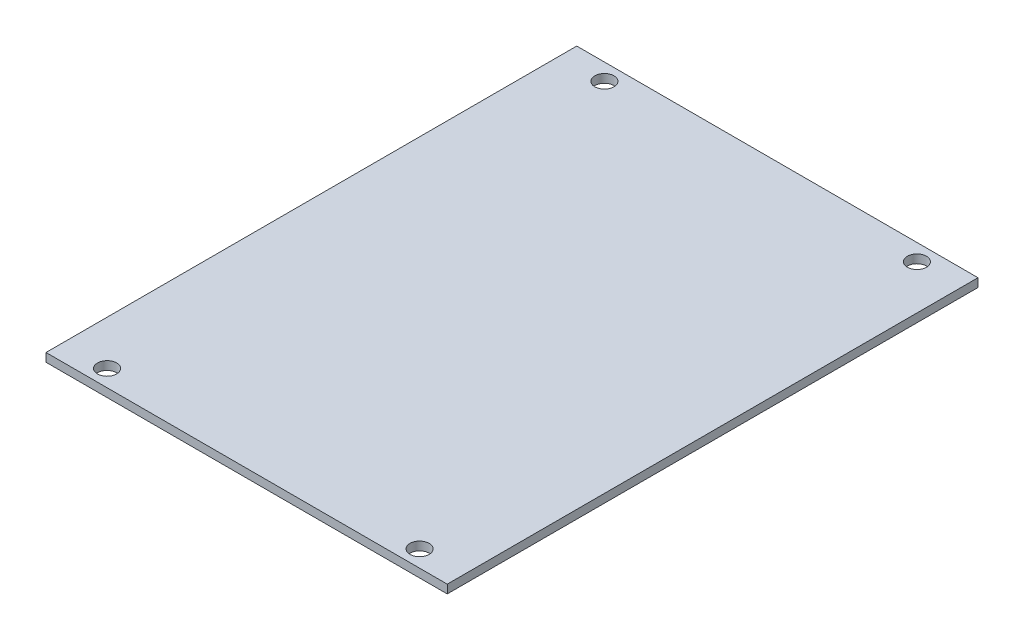
ISO-10303-21;
HEADER;
FILE_DESCRIPTION(('STEP AP214'),'2;1');
FILE_NAME('part.step','',(''),(''),'','','');
FILE_SCHEMA(('AUTOMOTIVE_DESIGN { 1 0 10303 214 1 1 1 1 }'));
ENDSEC;
DATA;
#1=APPLICATION_CONTEXT('core data for automotive mechanical design processes');
#2=APPLICATION_PROTOCOL_DEFINITION('international standard','automotive_design',2000,#1);
#3=PRODUCT_CONTEXT('',#1,'mechanical');
#4=PRODUCT('Part','Part','',(#3));
#5=PRODUCT_RELATED_PRODUCT_CATEGORY('part','',(#4));
#6=PRODUCT_DEFINITION_FORMATION('','',#4);
#7=PRODUCT_DEFINITION_CONTEXT('part definition',#1,'design');
#8=PRODUCT_DEFINITION('design','',#6,#7);
#9=PRODUCT_DEFINITION_SHAPE('','',#8);
#10=(LENGTH_UNIT() NAMED_UNIT(*) SI_UNIT(.MILLI.,.METRE.));
#11=(NAMED_UNIT(*) PLANE_ANGLE_UNIT() SI_UNIT($,.RADIAN.));
#12=(NAMED_UNIT(*) SI_UNIT($,.STERADIAN.) SOLID_ANGLE_UNIT());
#13=UNCERTAINTY_MEASURE_WITH_UNIT(LENGTH_MEASURE(1.E-05),#10,'distance_accuracy_value','');
#14=(GEOMETRIC_REPRESENTATION_CONTEXT(3) GLOBAL_UNCERTAINTY_ASSIGNED_CONTEXT((#13)) GLOBAL_UNIT_ASSIGNED_CONTEXT((#10,
#11,#12)) REPRESENTATION_CONTEXT('',''));
#15=CARTESIAN_POINT('',(0.,0.,0.));
#16=DIRECTION('',(0.,0.,1.));
#17=DIRECTION('',(1.,0.,0.));
#18=AXIS2_PLACEMENT_3D('',#15,#16,#17);
#19=CARTESIAN_POINT('',(35.9283,1.524,47.5234));
#20=DIRECTION('',(-1.,0.,0.));
#21=DIRECTION('',(0.,0.,1.));
#22=AXIS2_PLACEMENT_3D('',#19,#20,#21);
#23=PLANE('',#22);
#24=DIRECTION('',(0.,0.,-1.));
#25=VECTOR('',#24,1.);
#26=CARTESIAN_POINT('',(35.9283,0.,47.5234));
#27=LINE('',#26,#25);
#28=CARTESIAN_POINT('',(35.9283,0.,47.5234));
#29=VERTEX_POINT('',#28);
#30=CARTESIAN_POINT('',(35.9283,0.,-47.5234));
#31=VERTEX_POINT('',#30);
#32=EDGE_CURVE('E96',#29,#31,#27,.T.);
#33=ORIENTED_EDGE('',*,*,#32,.T.);
#34=DIRECTION('',(0.,-1.,0.));
#35=VECTOR('',#34,1.);
#36=CARTESIAN_POINT('',(35.9283,1.524,-47.5234));
#37=LINE('',#36,#35);
#38=CARTESIAN_POINT('',(35.9283,1.524,-47.5234));
#39=VERTEX_POINT('',#38);
#40=EDGE_CURVE('E11',#39,#31,#37,.T.);
#41=ORIENTED_EDGE('',*,*,#40,.F.);
#42=DIRECTION('',(0.,0.,-1.));
#43=VECTOR('',#42,1.);
#44=CARTESIAN_POINT('',(35.9283,1.524,47.5234));
#45=LINE('',#44,#43);
#46=CARTESIAN_POINT('',(35.9283,1.524,47.5234));
#47=VERTEX_POINT('',#46);
#48=EDGE_CURVE('E84',#47,#39,#45,.T.);
#49=ORIENTED_EDGE('',*,*,#48,.F.);
#50=DIRECTION('',(0.,-1.,0.));
#51=VECTOR('',#50,1.);
#52=CARTESIAN_POINT('',(35.9283,1.524,47.5234));
#53=LINE('',#52,#51);
#54=EDGE_CURVE('E92',#47,#29,#53,.T.);
#55=ORIENTED_EDGE('',*,*,#54,.T.);
#56=EDGE_LOOP('',(#33,#41,#49,#55));
#57=FACE_BOUND('',#56,.T.);
#58=ADVANCED_FACE('F33',(#57),#23,.F.);
#59=CARTESIAN_POINT('',(-35.9283,1.524,-47.5234));
#60=DIRECTION('',(0.,0.,1.));
#61=DIRECTION('',(1.,0.,0.));
#62=AXIS2_PLACEMENT_3D('',#59,#60,#61);
#63=PLANE('',#62);
#64=DIRECTION('',(-1.,0.,0.));
#65=VECTOR('',#64,1.);
#66=CARTESIAN_POINT('',(-35.9283,0.,-47.5234));
#67=LINE('',#66,#65);
#68=CARTESIAN_POINT('',(-35.9283,0.,-47.5234));
#69=VERTEX_POINT('',#68);
#70=EDGE_CURVE('E88',#31,#69,#67,.T.);
#71=ORIENTED_EDGE('',*,*,#70,.T.);
#72=DIRECTION('',(0.,-1.,0.));
#73=VECTOR('',#72,1.);
#74=CARTESIAN_POINT('',(-35.9283,1.524,-47.5234));
#75=LINE('',#74,#73);
#76=CARTESIAN_POINT('',(-35.9283,1.524,-47.5234));
#77=VERTEX_POINT('',#76);
#78=EDGE_CURVE('E41',#77,#69,#75,.T.);
#79=ORIENTED_EDGE('',*,*,#78,.F.);
#80=DIRECTION('',(-1.,0.,0.));
#81=VECTOR('',#80,1.);
#82=CARTESIAN_POINT('',(-35.9283,1.524,-47.5234));
#83=LINE('',#82,#81);
#84=EDGE_CURVE('E79',#39,#77,#83,.T.);
#85=ORIENTED_EDGE('',*,*,#84,.F.);
#86=ORIENTED_EDGE('',*,*,#40,.T.);
#87=EDGE_LOOP('',(#71,#79,#85,#86));
#88=FACE_BOUND('',#87,.T.);
#89=ADVANCED_FACE('F87',(#88),#63,.F.);
#90=CARTESIAN_POINT('',(-35.9283,1.524,47.5234));
#91=DIRECTION('',(1.,0.,0.));
#92=DIRECTION('',(0.,0.,-1.));
#93=AXIS2_PLACEMENT_3D('',#90,#91,#92);
#94=PLANE('',#93);
#95=DIRECTION('',(0.,0.,1.));
#96=VECTOR('',#95,1.);
#97=CARTESIAN_POINT('',(-35.9283,0.,47.5234));
#98=LINE('',#97,#96);
#99=CARTESIAN_POINT('',(-35.9283,0.,47.5234));
#100=VERTEX_POINT('',#99);
#101=EDGE_CURVE('E66',#69,#100,#98,.T.);
#102=ORIENTED_EDGE('',*,*,#101,.T.);
#103=DIRECTION('',(0.,-1.,0.));
#104=VECTOR('',#103,1.);
#105=CARTESIAN_POINT('',(-35.9283,1.524,47.5234));
#106=LINE('',#105,#104);
#107=CARTESIAN_POINT('',(-35.9283,1.524,47.5234));
#108=VERTEX_POINT('',#107);
#109=EDGE_CURVE('E89',#108,#100,#106,.T.);
#110=ORIENTED_EDGE('',*,*,#109,.F.);
#111=DIRECTION('',(0.,0.,1.));
#112=VECTOR('',#111,1.);
#113=CARTESIAN_POINT('',(-35.9283,1.524,47.5234));
#114=LINE('',#113,#112);
#115=EDGE_CURVE('E82',#77,#108,#114,.T.);
#116=ORIENTED_EDGE('',*,*,#115,.F.);
#117=ORIENTED_EDGE('',*,*,#78,.T.);
#118=EDGE_LOOP('',(#102,#110,#116,#117));
#119=FACE_BOUND('',#118,.T.);
#120=ADVANCED_FACE('F90',(#119),#94,.F.);
#121=CARTESIAN_POINT('',(-35.9283,1.524,47.5234));
#122=DIRECTION('',(0.,0.,-1.));
#123=DIRECTION('',(-1.,0.,0.));
#124=AXIS2_PLACEMENT_3D('',#121,#122,#123);
#125=PLANE('',#124);
#126=DIRECTION('',(1.,0.,0.));
#127=VECTOR('',#126,1.);
#128=CARTESIAN_POINT('',(-35.9283,0.,47.5234));
#129=LINE('',#128,#127);
#130=EDGE_CURVE('E72',#100,#29,#129,.T.);
#131=ORIENTED_EDGE('',*,*,#130,.T.);
#132=ORIENTED_EDGE('',*,*,#54,.F.);
#133=DIRECTION('',(1.,0.,0.));
#134=VECTOR('',#133,1.);
#135=CARTESIAN_POINT('',(-35.9283,1.524,47.5234));
#136=LINE('',#135,#134);
#137=EDGE_CURVE('E49',#108,#47,#136,.T.);
#138=ORIENTED_EDGE('',*,*,#137,.F.);
#139=ORIENTED_EDGE('',*,*,#109,.T.);
#140=EDGE_LOOP('',(#131,#132,#138,#139));
#141=FACE_BOUND('',#140,.T.);
#142=ADVANCED_FACE('F104',(#141),#125,.F.);
#143=CARTESIAN_POINT('',(0.,1.524,0.));
#144=DIRECTION('',(0.,-1.,0.));
#145=DIRECTION('',(0.,0.,-1.));
#146=AXIS2_PLACEMENT_3D('',#143,#144,#145);
#147=PLANE('',#146);
#148=CARTESIAN_POINT('',(-27.981275,1.524,44.53255));
#149=DIRECTION('',(0.,1.,0.));
#150=DIRECTION('',(0.,0.,1.));
#151=AXIS2_PLACEMENT_3D('',#148,#149,#150);
#152=CIRCLE('',#151,1.7145);
#153=CARTESIAN_POINT('',(-27.981275,1.524,46.24705));
#154=VERTEX_POINT('',#153);
#155=EDGE_CURVE('E128',#154,#154,#152,.T.);
#156=ORIENTED_EDGE('',*,*,#155,.F.);
#157=EDGE_LOOP('',(#156));
#158=FACE_BOUND('',#157,.T.);
#159=CARTESIAN_POINT('',(27.981275,1.524,44.53255));
#160=DIRECTION('',(0.,1.,0.));
#161=DIRECTION('',(0.,0.,1.));
#162=AXIS2_PLACEMENT_3D('',#159,#160,#161);
#163=CIRCLE('',#162,1.7145);
#164=CARTESIAN_POINT('',(27.981275,1.524,46.24705));
#165=VERTEX_POINT('',#164);
#166=EDGE_CURVE('E122',#165,#165,#163,.T.);
#167=ORIENTED_EDGE('',*,*,#166,.F.);
#168=EDGE_LOOP('',(#167));
#169=FACE_BOUND('',#168,.T.);
#170=CARTESIAN_POINT('',(27.981275,1.524,-44.53255));
#171=DIRECTION('',(0.,1.,0.));
#172=DIRECTION('',(0.,0.,1.));
#173=AXIS2_PLACEMENT_3D('',#170,#171,#172);
#174=CIRCLE('',#173,1.7145);
#175=CARTESIAN_POINT('',(27.981275,1.524,-42.81805));
#176=VERTEX_POINT('',#175);
#177=EDGE_CURVE('E116',#176,#176,#174,.T.);
#178=ORIENTED_EDGE('',*,*,#177,.F.);
#179=EDGE_LOOP('',(#178));
#180=FACE_BOUND('',#179,.T.);
#181=CARTESIAN_POINT('',(-27.981275,1.524,-44.53255));
#182=DIRECTION('',(0.,1.,0.));
#183=DIRECTION('',(0.,0.,1.));
#184=AXIS2_PLACEMENT_3D('',#181,#182,#183);
#185=CIRCLE('',#184,1.7145);
#186=CARTESIAN_POINT('',(-27.981275,1.524,-42.81805));
#187=VERTEX_POINT('',#186);
#188=EDGE_CURVE('E110',#187,#187,#185,.T.);
#189=ORIENTED_EDGE('',*,*,#188,.F.);
#190=EDGE_LOOP('',(#189));
#191=FACE_BOUND('',#190,.T.);
#192=ORIENTED_EDGE('',*,*,#48,.T.);
#193=ORIENTED_EDGE('',*,*,#84,.T.);
#194=ORIENTED_EDGE('',*,*,#115,.T.);
#195=ORIENTED_EDGE('',*,*,#137,.T.);
#196=EDGE_LOOP('',(#192,#193,#194,#195));
#197=FACE_BOUND('',#196,.T.);
#198=ADVANCED_FACE('F80',(#158,#169,#180,#191,#197),#147,.F.);
#199=CARTESIAN_POINT('',(0.,0.,0.));
#200=DIRECTION('',(0.,-1.,0.));
#201=DIRECTION('',(0.,0.,-1.));
#202=AXIS2_PLACEMENT_3D('',#199,#200,#201);
#203=PLANE('',#202);
#204=CARTESIAN_POINT('',(-27.981275,0.,44.53255));
#205=DIRECTION('',(0.,1.,0.));
#206=DIRECTION('',(0.,0.,1.));
#207=AXIS2_PLACEMENT_3D('',#204,#205,#206);
#208=CIRCLE('',#207,1.7145);
#209=CARTESIAN_POINT('',(-27.981275,0.,46.24705));
#210=VERTEX_POINT('',#209);
#211=EDGE_CURVE('E125',#210,#210,#208,.T.);
#212=ORIENTED_EDGE('',*,*,#211,.T.);
#213=EDGE_LOOP('',(#212));
#214=FACE_BOUND('',#213,.T.);
#215=CARTESIAN_POINT('',(27.981275,0.,44.53255));
#216=DIRECTION('',(0.,1.,0.));
#217=DIRECTION('',(0.,0.,1.));
#218=AXIS2_PLACEMENT_3D('',#215,#216,#217);
#219=CIRCLE('',#218,1.7145);
#220=CARTESIAN_POINT('',(27.981275,0.,46.24705));
#221=VERTEX_POINT('',#220);
#222=EDGE_CURVE('E119',#221,#221,#219,.T.);
#223=ORIENTED_EDGE('',*,*,#222,.T.);
#224=EDGE_LOOP('',(#223));
#225=FACE_BOUND('',#224,.T.);
#226=CARTESIAN_POINT('',(27.981275,0.,-44.53255));
#227=DIRECTION('',(0.,1.,0.));
#228=DIRECTION('',(0.,0.,1.));
#229=AXIS2_PLACEMENT_3D('',#226,#227,#228);
#230=CIRCLE('',#229,1.7145);
#231=CARTESIAN_POINT('',(27.981275,0.,-42.81805));
#232=VERTEX_POINT('',#231);
#233=EDGE_CURVE('E113',#232,#232,#230,.T.);
#234=ORIENTED_EDGE('',*,*,#233,.T.);
#235=EDGE_LOOP('',(#234));
#236=FACE_BOUND('',#235,.T.);
#237=CARTESIAN_POINT('',(-27.981275,0.,-44.53255));
#238=DIRECTION('',(0.,1.,0.));
#239=DIRECTION('',(0.,0.,1.));
#240=AXIS2_PLACEMENT_3D('',#237,#238,#239);
#241=CIRCLE('',#240,1.7145);
#242=CARTESIAN_POINT('',(-27.981275,0.,-42.81805));
#243=VERTEX_POINT('',#242);
#244=EDGE_CURVE('E99',#243,#243,#241,.T.);
#245=ORIENTED_EDGE('',*,*,#244,.T.);
#246=EDGE_LOOP('',(#245));
#247=FACE_BOUND('',#246,.T.);
#248=ORIENTED_EDGE('',*,*,#32,.F.);
#249=ORIENTED_EDGE('',*,*,#130,.F.);
#250=ORIENTED_EDGE('',*,*,#101,.F.);
#251=ORIENTED_EDGE('',*,*,#70,.F.);
#252=EDGE_LOOP('',(#248,#249,#250,#251));
#253=FACE_BOUND('',#252,.T.);
#254=ADVANCED_FACE('F107',(#214,#225,#236,#247,#253),#203,.T.);
#255=CARTESIAN_POINT('',(-27.981275,0.,-44.53255));
#256=DIRECTION('',(0.,1.,0.));
#257=DIRECTION('',(0.,0.,1.));
#258=AXIS2_PLACEMENT_3D('',#255,#256,#257);
#259=CYLINDRICAL_SURFACE('',#258,1.7145);
#260=CARTESIAN_POINT('',(-27.981275,0.,-42.81805));
#261=CARTESIAN_POINT('',(-27.981275,0.015875,-42.81805));
#262=CARTESIAN_POINT('',(-27.981275,0.03175,-42.81805));
#263=CARTESIAN_POINT('',(-27.981275,0.0635,-42.81805));
#264=CARTESIAN_POINT('',(-27.981275,0.079375,-42.81805));
#265=CARTESIAN_POINT('',(-27.981275,0.111125,-42.81805));
#266=CARTESIAN_POINT('',(-27.981275,0.127,-42.81805));
#267=CARTESIAN_POINT('',(-27.981275,0.15875,-42.81805));
#268=CARTESIAN_POINT('',(-27.981275,0.174625,-42.81805));
#269=CARTESIAN_POINT('',(-27.981275,0.206375,-42.81805));
#270=CARTESIAN_POINT('',(-27.981275,0.22225,-42.81805));
#271=CARTESIAN_POINT('',(-27.981275,0.254,-42.81805));
#272=CARTESIAN_POINT('',(-27.981275,0.269875,-42.81805));
#273=CARTESIAN_POINT('',(-27.981275,0.301625,-42.81805));
#274=CARTESIAN_POINT('',(-27.981275,0.3175,-42.81805));
#275=CARTESIAN_POINT('',(-27.981275,0.34925,-42.81805));
#276=CARTESIAN_POINT('',(-27.981275,0.365125,-42.81805));
#277=CARTESIAN_POINT('',(-27.981275,0.396875,-42.81805));
#278=CARTESIAN_POINT('',(-27.981275,0.41275,-42.81805));
#279=CARTESIAN_POINT('',(-27.981275,0.4445,-42.81805));
#280=CARTESIAN_POINT('',(-27.981275,0.460375,-42.81805));
#281=CARTESIAN_POINT('',(-27.981275,0.492125,-42.81805));
#282=CARTESIAN_POINT('',(-27.981275,0.508,-42.81805));
#283=CARTESIAN_POINT('',(-27.981275,0.53975,-42.81805));
#284=CARTESIAN_POINT('',(-27.981275,0.555625,-42.81805));
#285=CARTESIAN_POINT('',(-27.981275,0.587375,-42.81805));
#286=CARTESIAN_POINT('',(-27.981275,0.60325,-42.81805));
#287=CARTESIAN_POINT('',(-27.981275,0.635,-42.81805));
#288=CARTESIAN_POINT('',(-27.981275,0.650875,-42.81805));
#289=CARTESIAN_POINT('',(-27.981275,0.682625,-42.81805));
#290=CARTESIAN_POINT('',(-27.981275,0.6985,-42.81805));
#291=CARTESIAN_POINT('',(-27.981275,0.73025,-42.81805));
#292=CARTESIAN_POINT('',(-27.981275,0.746125,-42.81805));
#293=CARTESIAN_POINT('',(-27.981275,0.777875,-42.81805));
#294=CARTESIAN_POINT('',(-27.981275,0.79375,-42.81805));
#295=CARTESIAN_POINT('',(-27.981275,0.8255,-42.81805));
#296=CARTESIAN_POINT('',(-27.981275,0.841375,-42.81805));
#297=CARTESIAN_POINT('',(-27.981275,0.873125,-42.81805));
#298=CARTESIAN_POINT('',(-27.981275,0.889,-42.81805));
#299=CARTESIAN_POINT('',(-27.981275,0.92075,-42.81805));
#300=CARTESIAN_POINT('',(-27.981275,0.936625,-42.81805));
#301=CARTESIAN_POINT('',(-27.981275,0.968375,-42.81805));
#302=CARTESIAN_POINT('',(-27.981275,0.98425,-42.81805));
#303=CARTESIAN_POINT('',(-27.981275,1.016,-42.81805));
#304=CARTESIAN_POINT('',(-27.981275,1.031875,-42.81805));
#305=CARTESIAN_POINT('',(-27.981275,1.063625,-42.81805));
#306=CARTESIAN_POINT('',(-27.981275,1.0795,-42.81805));
#307=CARTESIAN_POINT('',(-27.981275,1.11125,-42.81805));
#308=CARTESIAN_POINT('',(-27.981275,1.127125,-42.81805));
#309=CARTESIAN_POINT('',(-27.981275,1.158875,-42.81805));
#310=CARTESIAN_POINT('',(-27.981275,1.17475,-42.81805));
#311=CARTESIAN_POINT('',(-27.981275,1.2065,-42.81805));
#312=CARTESIAN_POINT('',(-27.981275,1.222375,-42.81805));
#313=CARTESIAN_POINT('',(-27.981275,1.254125,-42.81805));
#314=CARTESIAN_POINT('',(-27.981275,1.27,-42.81805));
#315=CARTESIAN_POINT('',(-27.981275,1.30175,-42.81805));
#316=CARTESIAN_POINT('',(-27.981275,1.317625,-42.81805));
#317=CARTESIAN_POINT('',(-27.981275,1.349375,-42.81805));
#318=CARTESIAN_POINT('',(-27.981275,1.36525,-42.81805));
#319=CARTESIAN_POINT('',(-27.981275,1.397,-42.81805));
#320=CARTESIAN_POINT('',(-27.981275,1.412875,-42.81805));
#321=CARTESIAN_POINT('',(-27.981275,1.444625,-42.81805));
#322=CARTESIAN_POINT('',(-27.981275,1.4605,-42.81805));
#323=CARTESIAN_POINT('',(-27.981275,1.49225,-42.81805));
#324=CARTESIAN_POINT('',(-27.981275,1.508125,-42.81805));
#325=CARTESIAN_POINT('',(-27.981275,1.524,-42.81805));
#326=B_SPLINE_CURVE_WITH_KNOTS('',3,(#260,#261,#262,#263,#264,#265,#266,#267,#268,#269,#270,
#271,#272,#273,#274,#275,#276,#277,#278,#279,#280,#281,#282,#283,#284,#285,#286,#287,#288,#289,
#290,#291,#292,#293,#294,#295,#296,#297,#298,#299,#300,#301,#302,#303,#304,#305,#306,#307,#308,
#309,#310,#311,#312,#313,#314,#315,#316,#317,#318,#319,#320,#321,#322,#323,#324,#325),
.UNSPECIFIED.,.F.,.F.,(4,2,2,2,2,2,2,2,2,2,2,2,2,2,2,2,2,2,2,2,2,2,2,2,2,2,2,2,2,2,2,2,4),(0.,
0.047625,0.09525,0.142875,0.1905,0.238125,0.28575,0.333375,0.381,0.428625,0.47625,0.523875,
0.5715,0.619125,0.66675,0.714375,0.762,0.809625,0.85725,0.904875,0.9525,1.000125,1.04775,
1.095375,1.143,1.190625,1.23825,1.285875,1.3335,1.381125,1.42875,1.476375,1.524),.UNSPECIFIED.);
#327=EDGE_CURVE('BSEAM152',#243,#187,#326,.T.);
#328=ORIENTED_EDGE('',*,*,#244,.F.);
#329=ORIENTED_EDGE('',*,*,#188,.T.);
#330=ORIENTED_EDGE('',*,*,#327,.T.);
#331=ORIENTED_EDGE('',*,*,#327,.F.);
#332=EDGE_LOOP('',(#328,#330,#329,#331));
#333=FACE_BOUND('',#332,.T.);
#334=ADVANCED_FACE('F152',(#333),#259,.F.);
#335=CARTESIAN_POINT('',(27.981275,0.,-44.53255));
#336=DIRECTION('',(0.,1.,0.));
#337=DIRECTION('',(0.,0.,1.));
#338=AXIS2_PLACEMENT_3D('',#335,#336,#337);
#339=CYLINDRICAL_SURFACE('',#338,1.7145);
#340=CARTESIAN_POINT('',(27.981275,0.,-42.81805));
#341=CARTESIAN_POINT('',(27.981275,0.015875,-42.81805));
#342=CARTESIAN_POINT('',(27.981275,0.03175,-42.81805));
#343=CARTESIAN_POINT('',(27.981275,0.0635,-42.81805));
#344=CARTESIAN_POINT('',(27.981275,0.079375,-42.81805));
#345=CARTESIAN_POINT('',(27.981275,0.111125,-42.81805));
#346=CARTESIAN_POINT('',(27.981275,0.127,-42.81805));
#347=CARTESIAN_POINT('',(27.981275,0.15875,-42.81805));
#348=CARTESIAN_POINT('',(27.981275,0.174625,-42.81805));
#349=CARTESIAN_POINT('',(27.981275,0.206375,-42.81805));
#350=CARTESIAN_POINT('',(27.981275,0.22225,-42.81805));
#351=CARTESIAN_POINT('',(27.981275,0.254,-42.81805));
#352=CARTESIAN_POINT('',(27.981275,0.269875,-42.81805));
#353=CARTESIAN_POINT('',(27.981275,0.301625,-42.81805));
#354=CARTESIAN_POINT('',(27.981275,0.3175,-42.81805));
#355=CARTESIAN_POINT('',(27.981275,0.34925,-42.81805));
#356=CARTESIAN_POINT('',(27.981275,0.365125,-42.81805));
#357=CARTESIAN_POINT('',(27.981275,0.396875,-42.81805));
#358=CARTESIAN_POINT('',(27.981275,0.41275,-42.81805));
#359=CARTESIAN_POINT('',(27.981275,0.4445,-42.81805));
#360=CARTESIAN_POINT('',(27.981275,0.460375,-42.81805));
#361=CARTESIAN_POINT('',(27.981275,0.492125,-42.81805));
#362=CARTESIAN_POINT('',(27.981275,0.508,-42.81805));
#363=CARTESIAN_POINT('',(27.981275,0.53975,-42.81805));
#364=CARTESIAN_POINT('',(27.981275,0.555625,-42.81805));
#365=CARTESIAN_POINT('',(27.981275,0.587375,-42.81805));
#366=CARTESIAN_POINT('',(27.981275,0.60325,-42.81805));
#367=CARTESIAN_POINT('',(27.981275,0.635,-42.81805));
#368=CARTESIAN_POINT('',(27.981275,0.650875,-42.81805));
#369=CARTESIAN_POINT('',(27.981275,0.682625,-42.81805));
#370=CARTESIAN_POINT('',(27.981275,0.6985,-42.81805));
#371=CARTESIAN_POINT('',(27.981275,0.73025,-42.81805));
#372=CARTESIAN_POINT('',(27.981275,0.746125,-42.81805));
#373=CARTESIAN_POINT('',(27.981275,0.777875,-42.81805));
#374=CARTESIAN_POINT('',(27.981275,0.79375,-42.81805));
#375=CARTESIAN_POINT('',(27.981275,0.8255,-42.81805));
#376=CARTESIAN_POINT('',(27.981275,0.841375,-42.81805));
#377=CARTESIAN_POINT('',(27.981275,0.873125,-42.81805));
#378=CARTESIAN_POINT('',(27.981275,0.889,-42.81805));
#379=CARTESIAN_POINT('',(27.981275,0.92075,-42.81805));
#380=CARTESIAN_POINT('',(27.981275,0.936625,-42.81805));
#381=CARTESIAN_POINT('',(27.981275,0.968375,-42.81805));
#382=CARTESIAN_POINT('',(27.981275,0.98425,-42.81805));
#383=CARTESIAN_POINT('',(27.981275,1.016,-42.81805));
#384=CARTESIAN_POINT('',(27.981275,1.031875,-42.81805));
#385=CARTESIAN_POINT('',(27.981275,1.063625,-42.81805));
#386=CARTESIAN_POINT('',(27.981275,1.0795,-42.81805));
#387=CARTESIAN_POINT('',(27.981275,1.11125,-42.81805));
#388=CARTESIAN_POINT('',(27.981275,1.127125,-42.81805));
#389=CARTESIAN_POINT('',(27.981275,1.158875,-42.81805));
#390=CARTESIAN_POINT('',(27.981275,1.17475,-42.81805));
#391=CARTESIAN_POINT('',(27.981275,1.2065,-42.81805));
#392=CARTESIAN_POINT('',(27.981275,1.222375,-42.81805));
#393=CARTESIAN_POINT('',(27.981275,1.254125,-42.81805));
#394=CARTESIAN_POINT('',(27.981275,1.27,-42.81805));
#395=CARTESIAN_POINT('',(27.981275,1.30175,-42.81805));
#396=CARTESIAN_POINT('',(27.981275,1.317625,-42.81805));
#397=CARTESIAN_POINT('',(27.981275,1.349375,-42.81805));
#398=CARTESIAN_POINT('',(27.981275,1.36525,-42.81805));
#399=CARTESIAN_POINT('',(27.981275,1.397,-42.81805));
#400=CARTESIAN_POINT('',(27.981275,1.412875,-42.81805));
#401=CARTESIAN_POINT('',(27.981275,1.444625,-42.81805));
#402=CARTESIAN_POINT('',(27.981275,1.4605,-42.81805));
#403=CARTESIAN_POINT('',(27.981275,1.49225,-42.81805));
#404=CARTESIAN_POINT('',(27.981275,1.508125,-42.81805));
#405=CARTESIAN_POINT('',(27.981275,1.524,-42.81805));
#406=B_SPLINE_CURVE_WITH_KNOTS('',3,(#340,#341,#342,#343,#344,#345,#346,#347,#348,#349,#350,
#351,#352,#353,#354,#355,#356,#357,#358,#359,#360,#361,#362,#363,#364,#365,#366,#367,#368,#369,
#370,#371,#372,#373,#374,#375,#376,#377,#378,#379,#380,#381,#382,#383,#384,#385,#386,#387,#388,
#389,#390,#391,#392,#393,#394,#395,#396,#397,#398,#399,#400,#401,#402,#403,#404,#405),
.UNSPECIFIED.,.F.,.F.,(4,2,2,2,2,2,2,2,2,2,2,2,2,2,2,2,2,2,2,2,2,2,2,2,2,2,2,2,2,2,2,2,4),(0.,
0.047625,0.09525,0.142875,0.1905,0.238125,0.28575,0.333375,0.381,0.428625,0.47625,0.523875,
0.5715,0.619125,0.66675,0.714375,0.762,0.809625,0.85725,0.904875,0.9525,1.000125,1.04775,
1.095375,1.143,1.190625,1.23825,1.285875,1.3335,1.381125,1.42875,1.476375,1.524),.UNSPECIFIED.);
#407=EDGE_CURVE('BSEAM154',#232,#176,#406,.T.);
#408=ORIENTED_EDGE('',*,*,#233,.F.);
#409=ORIENTED_EDGE('',*,*,#177,.T.);
#410=ORIENTED_EDGE('',*,*,#407,.T.);
#411=ORIENTED_EDGE('',*,*,#407,.F.);
#412=EDGE_LOOP('',(#408,#410,#409,#411));
#413=FACE_BOUND('',#412,.T.);
#414=ADVANCED_FACE('F154',(#413),#339,.F.);
#415=CARTESIAN_POINT('',(27.981275,0.,44.53255));
#416=DIRECTION('',(0.,1.,0.));
#417=DIRECTION('',(0.,0.,1.));
#418=AXIS2_PLACEMENT_3D('',#415,#416,#417);
#419=CYLINDRICAL_SURFACE('',#418,1.7145);
#420=CARTESIAN_POINT('',(27.981275,0.,46.24705));
#421=CARTESIAN_POINT('',(27.981275,0.015875,46.24705));
#422=CARTESIAN_POINT('',(27.981275,0.03175,46.24705));
#423=CARTESIAN_POINT('',(27.981275,0.0635,46.24705));
#424=CARTESIAN_POINT('',(27.981275,0.079375,46.24705));
#425=CARTESIAN_POINT('',(27.981275,0.111125,46.24705));
#426=CARTESIAN_POINT('',(27.981275,0.127,46.24705));
#427=CARTESIAN_POINT('',(27.981275,0.15875,46.24705));
#428=CARTESIAN_POINT('',(27.981275,0.174625,46.24705));
#429=CARTESIAN_POINT('',(27.981275,0.206375,46.24705));
#430=CARTESIAN_POINT('',(27.981275,0.22225,46.24705));
#431=CARTESIAN_POINT('',(27.981275,0.254,46.24705));
#432=CARTESIAN_POINT('',(27.981275,0.269875,46.24705));
#433=CARTESIAN_POINT('',(27.981275,0.301625,46.24705));
#434=CARTESIAN_POINT('',(27.981275,0.3175,46.24705));
#435=CARTESIAN_POINT('',(27.981275,0.34925,46.24705));
#436=CARTESIAN_POINT('',(27.981275,0.365125,46.24705));
#437=CARTESIAN_POINT('',(27.981275,0.396875,46.24705));
#438=CARTESIAN_POINT('',(27.981275,0.41275,46.24705));
#439=CARTESIAN_POINT('',(27.981275,0.4445,46.24705));
#440=CARTESIAN_POINT('',(27.981275,0.460375,46.24705));
#441=CARTESIAN_POINT('',(27.981275,0.492125,46.24705));
#442=CARTESIAN_POINT('',(27.981275,0.508,46.24705));
#443=CARTESIAN_POINT('',(27.981275,0.53975,46.24705));
#444=CARTESIAN_POINT('',(27.981275,0.555625,46.24705));
#445=CARTESIAN_POINT('',(27.981275,0.587375,46.24705));
#446=CARTESIAN_POINT('',(27.981275,0.60325,46.24705));
#447=CARTESIAN_POINT('',(27.981275,0.635,46.24705));
#448=CARTESIAN_POINT('',(27.981275,0.650875,46.24705));
#449=CARTESIAN_POINT('',(27.981275,0.682625,46.24705));
#450=CARTESIAN_POINT('',(27.981275,0.6985,46.24705));
#451=CARTESIAN_POINT('',(27.981275,0.73025,46.24705));
#452=CARTESIAN_POINT('',(27.981275,0.746125,46.24705));
#453=CARTESIAN_POINT('',(27.981275,0.777875,46.24705));
#454=CARTESIAN_POINT('',(27.981275,0.79375,46.24705));
#455=CARTESIAN_POINT('',(27.981275,0.8255,46.24705));
#456=CARTESIAN_POINT('',(27.981275,0.841375,46.24705));
#457=CARTESIAN_POINT('',(27.981275,0.873125,46.24705));
#458=CARTESIAN_POINT('',(27.981275,0.889,46.24705));
#459=CARTESIAN_POINT('',(27.981275,0.92075,46.24705));
#460=CARTESIAN_POINT('',(27.981275,0.936625,46.24705));
#461=CARTESIAN_POINT('',(27.981275,0.968375,46.24705));
#462=CARTESIAN_POINT('',(27.981275,0.98425,46.24705));
#463=CARTESIAN_POINT('',(27.981275,1.016,46.24705));
#464=CARTESIAN_POINT('',(27.981275,1.031875,46.24705));
#465=CARTESIAN_POINT('',(27.981275,1.063625,46.24705));
#466=CARTESIAN_POINT('',(27.981275,1.0795,46.24705));
#467=CARTESIAN_POINT('',(27.981275,1.11125,46.24705));
#468=CARTESIAN_POINT('',(27.981275,1.127125,46.24705));
#469=CARTESIAN_POINT('',(27.981275,1.158875,46.24705));
#470=CARTESIAN_POINT('',(27.981275,1.17475,46.24705));
#471=CARTESIAN_POINT('',(27.981275,1.2065,46.24705));
#472=CARTESIAN_POINT('',(27.981275,1.222375,46.24705));
#473=CARTESIAN_POINT('',(27.981275,1.254125,46.24705));
#474=CARTESIAN_POINT('',(27.981275,1.27,46.24705));
#475=CARTESIAN_POINT('',(27.981275,1.30175,46.24705));
#476=CARTESIAN_POINT('',(27.981275,1.317625,46.24705));
#477=CARTESIAN_POINT('',(27.981275,1.349375,46.24705));
#478=CARTESIAN_POINT('',(27.981275,1.36525,46.24705));
#479=CARTESIAN_POINT('',(27.981275,1.397,46.24705));
#480=CARTESIAN_POINT('',(27.981275,1.412875,46.24705));
#481=CARTESIAN_POINT('',(27.981275,1.444625,46.24705));
#482=CARTESIAN_POINT('',(27.981275,1.4605,46.24705));
#483=CARTESIAN_POINT('',(27.981275,1.49225,46.24705));
#484=CARTESIAN_POINT('',(27.981275,1.508125,46.24705));
#485=CARTESIAN_POINT('',(27.981275,1.524,46.24705));
#486=B_SPLINE_CURVE_WITH_KNOTS('',3,(#420,#421,#422,#423,#424,#425,#426,#427,#428,#429,#430,
#431,#432,#433,#434,#435,#436,#437,#438,#439,#440,#441,#442,#443,#444,#445,#446,#447,#448,#449,
#450,#451,#452,#453,#454,#455,#456,#457,#458,#459,#460,#461,#462,#463,#464,#465,#466,#467,#468,
#469,#470,#471,#472,#473,#474,#475,#476,#477,#478,#479,#480,#481,#482,#483,#484,#485),
.UNSPECIFIED.,.F.,.F.,(4,2,2,2,2,2,2,2,2,2,2,2,2,2,2,2,2,2,2,2,2,2,2,2,2,2,2,2,2,2,2,2,4),(0.,
0.047625,0.09525,0.142875,0.1905,0.238125,0.28575,0.333375,0.381,0.428625,0.47625,0.523875,
0.5715,0.619125,0.66675,0.714375,0.762,0.809625,0.85725,0.904875,0.9525,1.000125,1.04775,
1.095375,1.143,1.190625,1.23825,1.285875,1.3335,1.381125,1.42875,1.476375,1.524),.UNSPECIFIED.);
#487=EDGE_CURVE('BSEAM139',#221,#165,#486,.T.);
#488=ORIENTED_EDGE('',*,*,#222,.F.);
#489=ORIENTED_EDGE('',*,*,#166,.T.);
#490=ORIENTED_EDGE('',*,*,#487,.T.);
#491=ORIENTED_EDGE('',*,*,#487,.F.);
#492=EDGE_LOOP('',(#488,#490,#489,#491));
#493=FACE_BOUND('',#492,.T.);
#494=ADVANCED_FACE('F139',(#493),#419,.F.);
#495=CARTESIAN_POINT('',(-27.981275,0.,44.53255));
#496=DIRECTION('',(0.,1.,0.));
#497=DIRECTION('',(0.,0.,1.));
#498=AXIS2_PLACEMENT_3D('',#495,#496,#497);
#499=CYLINDRICAL_SURFACE('',#498,1.7145);
#500=CARTESIAN_POINT('',(-27.981275,0.,46.24705));
#501=CARTESIAN_POINT('',(-27.981275,0.015875,46.24705));
#502=CARTESIAN_POINT('',(-27.981275,0.03175,46.24705));
#503=CARTESIAN_POINT('',(-27.981275,0.0635,46.24705));
#504=CARTESIAN_POINT('',(-27.981275,0.079375,46.24705));
#505=CARTESIAN_POINT('',(-27.981275,0.111125,46.24705));
#506=CARTESIAN_POINT('',(-27.981275,0.127,46.24705));
#507=CARTESIAN_POINT('',(-27.981275,0.15875,46.24705));
#508=CARTESIAN_POINT('',(-27.981275,0.174625,46.24705));
#509=CARTESIAN_POINT('',(-27.981275,0.206375,46.24705));
#510=CARTESIAN_POINT('',(-27.981275,0.22225,46.24705));
#511=CARTESIAN_POINT('',(-27.981275,0.254,46.24705));
#512=CARTESIAN_POINT('',(-27.981275,0.269875,46.24705));
#513=CARTESIAN_POINT('',(-27.981275,0.301625,46.24705));
#514=CARTESIAN_POINT('',(-27.981275,0.3175,46.24705));
#515=CARTESIAN_POINT('',(-27.981275,0.34925,46.24705));
#516=CARTESIAN_POINT('',(-27.981275,0.365125,46.24705));
#517=CARTESIAN_POINT('',(-27.981275,0.396875,46.24705));
#518=CARTESIAN_POINT('',(-27.981275,0.41275,46.24705));
#519=CARTESIAN_POINT('',(-27.981275,0.4445,46.24705));
#520=CARTESIAN_POINT('',(-27.981275,0.460375,46.24705));
#521=CARTESIAN_POINT('',(-27.981275,0.492125,46.24705));
#522=CARTESIAN_POINT('',(-27.981275,0.508,46.24705));
#523=CARTESIAN_POINT('',(-27.981275,0.53975,46.24705));
#524=CARTESIAN_POINT('',(-27.981275,0.555625,46.24705));
#525=CARTESIAN_POINT('',(-27.981275,0.587375,46.24705));
#526=CARTESIAN_POINT('',(-27.981275,0.60325,46.24705));
#527=CARTESIAN_POINT('',(-27.981275,0.635,46.24705));
#528=CARTESIAN_POINT('',(-27.981275,0.650875,46.24705));
#529=CARTESIAN_POINT('',(-27.981275,0.682625,46.24705));
#530=CARTESIAN_POINT('',(-27.981275,0.6985,46.24705));
#531=CARTESIAN_POINT('',(-27.981275,0.73025,46.24705));
#532=CARTESIAN_POINT('',(-27.981275,0.746125,46.24705));
#533=CARTESIAN_POINT('',(-27.981275,0.777875,46.24705));
#534=CARTESIAN_POINT('',(-27.981275,0.79375,46.24705));
#535=CARTESIAN_POINT('',(-27.981275,0.8255,46.24705));
#536=CARTESIAN_POINT('',(-27.981275,0.841375,46.24705));
#537=CARTESIAN_POINT('',(-27.981275,0.873125,46.24705));
#538=CARTESIAN_POINT('',(-27.981275,0.889,46.24705));
#539=CARTESIAN_POINT('',(-27.981275,0.92075,46.24705));
#540=CARTESIAN_POINT('',(-27.981275,0.936625,46.24705));
#541=CARTESIAN_POINT('',(-27.981275,0.968375,46.24705));
#542=CARTESIAN_POINT('',(-27.981275,0.98425,46.24705));
#543=CARTESIAN_POINT('',(-27.981275,1.016,46.24705));
#544=CARTESIAN_POINT('',(-27.981275,1.031875,46.24705));
#545=CARTESIAN_POINT('',(-27.981275,1.063625,46.24705));
#546=CARTESIAN_POINT('',(-27.981275,1.0795,46.24705));
#547=CARTESIAN_POINT('',(-27.981275,1.11125,46.24705));
#548=CARTESIAN_POINT('',(-27.981275,1.127125,46.24705));
#549=CARTESIAN_POINT('',(-27.981275,1.158875,46.24705));
#550=CARTESIAN_POINT('',(-27.981275,1.17475,46.24705));
#551=CARTESIAN_POINT('',(-27.981275,1.2065,46.24705));
#552=CARTESIAN_POINT('',(-27.981275,1.222375,46.24705));
#553=CARTESIAN_POINT('',(-27.981275,1.254125,46.24705));
#554=CARTESIAN_POINT('',(-27.981275,1.27,46.24705));
#555=CARTESIAN_POINT('',(-27.981275,1.30175,46.24705));
#556=CARTESIAN_POINT('',(-27.981275,1.317625,46.24705));
#557=CARTESIAN_POINT('',(-27.981275,1.349375,46.24705));
#558=CARTESIAN_POINT('',(-27.981275,1.36525,46.24705));
#559=CARTESIAN_POINT('',(-27.981275,1.397,46.24705));
#560=CARTESIAN_POINT('',(-27.981275,1.412875,46.24705));
#561=CARTESIAN_POINT('',(-27.981275,1.444625,46.24705));
#562=CARTESIAN_POINT('',(-27.981275,1.4605,46.24705));
#563=CARTESIAN_POINT('',(-27.981275,1.49225,46.24705));
#564=CARTESIAN_POINT('',(-27.981275,1.508125,46.24705));
#565=CARTESIAN_POINT('',(-27.981275,1.524,46.24705));
#566=B_SPLINE_CURVE_WITH_KNOTS('',3,(#500,#501,#502,#503,#504,#505,#506,#507,#508,#509,#510,
#511,#512,#513,#514,#515,#516,#517,#518,#519,#520,#521,#522,#523,#524,#525,#526,#527,#528,#529,
#530,#531,#532,#533,#534,#535,#536,#537,#538,#539,#540,#541,#542,#543,#544,#545,#546,#547,#548,
#549,#550,#551,#552,#553,#554,#555,#556,#557,#558,#559,#560,#561,#562,#563,#564,#565),
.UNSPECIFIED.,.F.,.F.,(4,2,2,2,2,2,2,2,2,2,2,2,2,2,2,2,2,2,2,2,2,2,2,2,2,2,2,2,2,2,2,2,4),(0.,
0.047625,0.09525,0.142875,0.1905,0.238125,0.28575,0.333375,0.381,0.428625,0.47625,0.523875,
0.5715,0.619125,0.66675,0.714375,0.762,0.809625,0.85725,0.904875,0.9525,1.000125,1.04775,
1.095375,1.143,1.190625,1.23825,1.285875,1.3335,1.381125,1.42875,1.476375,1.524),.UNSPECIFIED.);
#567=EDGE_CURVE('BSEAM136',#210,#154,#566,.T.);
#568=ORIENTED_EDGE('',*,*,#211,.F.);
#569=ORIENTED_EDGE('',*,*,#155,.T.);
#570=ORIENTED_EDGE('',*,*,#567,.T.);
#571=ORIENTED_EDGE('',*,*,#567,.F.);
#572=EDGE_LOOP('',(#568,#570,#569,#571));
#573=FACE_BOUND('',#572,.T.);
#574=ADVANCED_FACE('F136',(#573),#499,.F.);
#575=CLOSED_SHELL('',(#58,#89,#120,#142,#198,#254,#334,#414,#494,#574));
#576=MANIFOLD_SOLID_BREP('B2',#575);
#577=ADVANCED_BREP_SHAPE_REPRESENTATION('',(#18,#576),#14);
#578=SHAPE_DEFINITION_REPRESENTATION(#9,#577);
ENDSEC;
END-ISO-10303-21;
